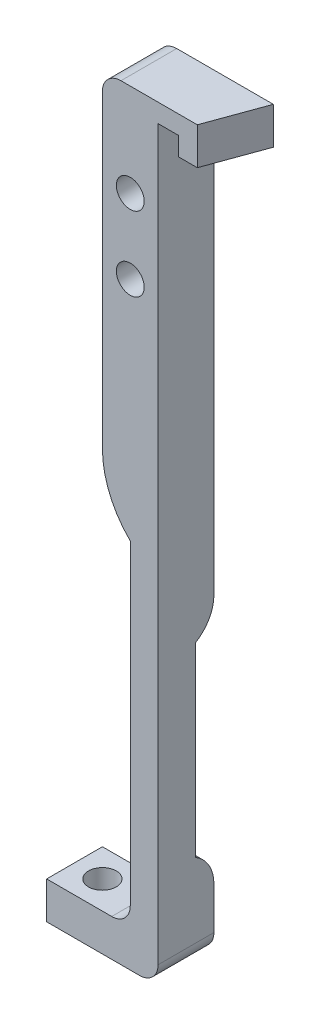
ISO-10303-21;
HEADER;
FILE_DESCRIPTION(('STEP AP214'),'2;1');
FILE_NAME('part.step','',(''),(''),'','','');
FILE_SCHEMA(('AUTOMOTIVE_DESIGN { 1 0 10303 214 1 1 1 1 }'));
ENDSEC;
DATA;
#1=APPLICATION_CONTEXT('core data for automotive mechanical design processes');
#2=APPLICATION_PROTOCOL_DEFINITION('international standard','automotive_design',2000,#1);
#3=PRODUCT_CONTEXT('',#1,'mechanical');
#4=PRODUCT('Part','Part','',(#3));
#5=PRODUCT_RELATED_PRODUCT_CATEGORY('part','',(#4));
#6=PRODUCT_DEFINITION_FORMATION('','',#4);
#7=PRODUCT_DEFINITION_CONTEXT('part definition',#1,'design');
#8=PRODUCT_DEFINITION('design','',#6,#7);
#9=PRODUCT_DEFINITION_SHAPE('','',#8);
#10=(LENGTH_UNIT() NAMED_UNIT(*) SI_UNIT(.MILLI.,.METRE.));
#11=(NAMED_UNIT(*) PLANE_ANGLE_UNIT() SI_UNIT($,.RADIAN.));
#12=(NAMED_UNIT(*) SI_UNIT($,.STERADIAN.) SOLID_ANGLE_UNIT());
#13=UNCERTAINTY_MEASURE_WITH_UNIT(LENGTH_MEASURE(1.E-05),#10,'distance_accuracy_value','');
#14=(GEOMETRIC_REPRESENTATION_CONTEXT(3) GLOBAL_UNCERTAINTY_ASSIGNED_CONTEXT((#13)) GLOBAL_UNIT_ASSIGNED_CONTEXT((#10,
#11,#12)) REPRESENTATION_CONTEXT('',''));
#15=CARTESIAN_POINT('',(0.,0.,0.));
#16=DIRECTION('',(0.,0.,1.));
#17=DIRECTION('',(1.,0.,0.));
#18=AXIS2_PLACEMENT_3D('',#15,#16,#17);
#19=CARTESIAN_POINT('',(7.62,0.,-15.24));
#20=DIRECTION('',(0.,0.,1.));
#21=DIRECTION('',(-1.,0.,0.));
#22=AXIS2_PLACEMENT_3D('',#19,#20,#21);
#23=PLANE('',#22);
#24=CARTESIAN_POINT('',(3.81,91.948,-15.24));
#25=DIRECTION('',(0.,0.,1.));
#26=DIRECTION('',(1.,0.,0.));
#27=AXIS2_PLACEMENT_3D('',#24,#25,#26);
#28=CIRCLE('',#27,1.90500000000001);
#29=CARTESIAN_POINT('',(5.71500000000001,91.948,-15.24));
#30=VERTEX_POINT('',#29);
#31=EDGE_CURVE('E193',#30,#30,#28,.T.);
#32=ORIENTED_EDGE('',*,*,#31,.T.);
#33=EDGE_LOOP('',(#32));
#34=FACE_BOUND('',#33,.T.);
#35=CARTESIAN_POINT('',(3.81,81.788,-15.24));
#36=DIRECTION('',(0.,0.,1.));
#37=DIRECTION('',(1.,0.,0.));
#38=AXIS2_PLACEMENT_3D('',#35,#36,#37);
#39=CIRCLE('',#38,1.90500000000001);
#40=CARTESIAN_POINT('',(5.71500000000001,81.788,-15.24));
#41=VERTEX_POINT('',#40);
#42=EDGE_CURVE('E189',#41,#41,#39,.T.);
#43=ORIENTED_EDGE('',*,*,#42,.T.);
#44=EDGE_LOOP('',(#43));
#45=FACE_BOUND('',#44,.T.);
#46=DIRECTION('',(0.,-1.,0.));
#47=VECTOR('',#46,1.);
#48=CARTESIAN_POINT('',(7.62,0.,-15.24));
#49=LINE('',#48,#47);
#50=CARTESIAN_POINT('',(7.62,102.108,-15.24));
#51=VERTEX_POINT('',#50);
#52=CARTESIAN_POINT('',(7.62,42.4994090512249,-15.24));
#53=VERTEX_POINT('',#52);
#54=EDGE_CURVE('E246',#51,#53,#49,.T.);
#55=ORIENTED_EDGE('',*,*,#54,.T.);
#56=DIRECTION('',(1.,0.,0.));
#57=VECTOR('',#56,1.);
#58=CARTESIAN_POINT('',(7.62,42.4994090512249,-15.24));
#59=LINE('',#58,#57);
#60=CARTESIAN_POINT('',(3.81,42.4994090512249,-15.24));
#61=VERTEX_POINT('',#60);
#62=EDGE_CURVE('E11',#53,#61,#59,.F.);
#63=ORIENTED_EDGE('',*,*,#62,.T.);
#64=DIRECTION('',(0.,1.,0.));
#65=VECTOR('',#64,1.);
#66=CARTESIAN_POINT('',(3.81,5.08,-15.24));
#67=LINE('',#66,#65);
#68=CARTESIAN_POINT('',(3.81,50.8,-15.24));
#69=VERTEX_POINT('',#68);
#70=EDGE_CURVE('E200',#61,#69,#67,.T.);
#71=ORIENTED_EDGE('',*,*,#70,.T.);
#72=CARTESIAN_POINT('',(12.7,59.8696141042494,-15.24));
#73=DIRECTION('',(0.,0.,-1.));
#74=DIRECTION('',(-1.,0.,0.));
#75=AXIS2_PLACEMENT_3D('',#72,#73,#74);
#76=CIRCLE('',#75,12.7);
#77=CARTESIAN_POINT('',(0.,59.8696141042494,-15.24));
#78=VERTEX_POINT('',#77);
#79=EDGE_CURVE('E340',#78,#69,#76,.F.);
#80=ORIENTED_EDGE('',*,*,#79,.F.);
#81=DIRECTION('',(0.,-1.,0.));
#82=VECTOR('',#81,1.);
#83=CARTESIAN_POINT('',(0.,0.,-15.24));
#84=LINE('',#83,#82);
#85=CARTESIAN_POINT('',(0.,102.108,-15.24));
#86=VERTEX_POINT('',#85);
#87=EDGE_CURVE('E263',#86,#78,#84,.T.);
#88=ORIENTED_EDGE('',*,*,#87,.F.);
#89=CARTESIAN_POINT('',(2.54,102.108,-15.24));
#90=DIRECTION('',(0.,0.,-1.));
#91=DIRECTION('',(-1.,0.,0.));
#92=AXIS2_PLACEMENT_3D('',#89,#90,#91);
#93=CIRCLE('',#92,2.54);
#94=CARTESIAN_POINT('',(2.54,104.648,-15.24));
#95=VERTEX_POINT('',#94);
#96=EDGE_CURVE('E305',#95,#86,#93,.F.);
#97=ORIENTED_EDGE('',*,*,#96,.F.);
#98=DIRECTION('',(-1.,0.,0.));
#99=VECTOR('',#98,1.);
#100=CARTESIAN_POINT('',(7.62,104.648,-15.24));
#101=LINE('',#100,#99);
#102=CARTESIAN_POINT('',(15.748,104.648,-15.24));
#103=VERTEX_POINT('',#102);
#104=EDGE_CURVE('E271',#103,#95,#101,.T.);
#105=ORIENTED_EDGE('',*,*,#104,.F.);
#106=DIRECTION('',(0.,-1.,0.));
#107=VECTOR('',#106,1.);
#108=CARTESIAN_POINT('',(15.748,104.648,-15.24));
#109=LINE('',#108,#107);
#110=CARTESIAN_POINT('',(15.748,99.568,-15.24));
#111=VERTEX_POINT('',#110);
#112=EDGE_CURVE('E234',#103,#111,#109,.T.);
#113=ORIENTED_EDGE('',*,*,#112,.T.);
#114=DIRECTION('',(-1.,0.,0.));
#115=VECTOR('',#114,1.);
#116=CARTESIAN_POINT('',(15.748,99.568,-15.24));
#117=LINE('',#116,#115);
#118=CARTESIAN_POINT('',(13.2079999999999,99.568,-15.24));
#119=VERTEX_POINT('',#118);
#120=EDGE_CURVE('E214',#111,#119,#117,.T.);
#121=ORIENTED_EDGE('',*,*,#120,.T.);
#122=DIRECTION('',(0.,1.,0.));
#123=VECTOR('',#122,1.);
#124=CARTESIAN_POINT('',(13.2079999999999,99.568,-15.24));
#125=LINE('',#124,#123);
#126=CARTESIAN_POINT('',(13.2079999999999,102.108,-15.24));
#127=VERTEX_POINT('',#126);
#128=EDGE_CURVE('E231',#119,#127,#125,.T.);
#129=ORIENTED_EDGE('',*,*,#128,.T.);
#130=DIRECTION('',(-1.,0.,0.));
#131=VECTOR('',#130,1.);
#132=CARTESIAN_POINT('',(15.748,102.108,-15.24));
#133=LINE('',#132,#131);
#134=EDGE_CURVE('E255',#127,#51,#133,.T.);
#135=ORIENTED_EDGE('',*,*,#134,.T.);
#136=EDGE_LOOP('',(#55,#63,#71,#80,#88,#97,#105,#113,#121,#129,#135));
#137=FACE_BOUND('',#136,.T.);
#138=ADVANCED_FACE('F32',(#34,#45,#137),#23,.F.);
#139=CARTESIAN_POINT('',(15.748,102.108,-15.24));
#140=DIRECTION('',(0.,1.,0.));
#141=DIRECTION('',(0.,0.,-1.));
#142=AXIS2_PLACEMENT_3D('',#139,#140,#141);
#143=PLANE('',#142);
#144=DIRECTION('',(-0.342020143325663,0.,0.93969262078591));
#145=VECTOR('',#144,1.);
#146=CARTESIAN_POINT('',(10.4345468148915,102.108,-7.62));
#147=LINE('',#146,#145);
#148=CARTESIAN_POINT('',(10.4345468148915,102.108,-7.62));
#149=VERTEX_POINT('',#148);
#150=EDGE_CURVE('E213',#127,#149,#147,.T.);
#151=ORIENTED_EDGE('',*,*,#150,.T.);
#152=DIRECTION('',(-1.,0.,0.));
#153=VECTOR('',#152,1.);
#154=CARTESIAN_POINT('',(15.748,102.108,-7.62));
#155=LINE('',#154,#153);
#156=CARTESIAN_POINT('',(7.62,102.108,-7.62));
#157=VERTEX_POINT('',#156);
#158=EDGE_CURVE('E237',#149,#157,#155,.T.);
#159=ORIENTED_EDGE('',*,*,#158,.T.);
#160=DIRECTION('',(0.,0.,1.));
#161=VECTOR('',#160,1.);
#162=CARTESIAN_POINT('',(7.62,102.108,-15.24));
#163=LINE('',#162,#161);
#164=EDGE_CURVE('E233',#51,#157,#163,.T.);
#165=ORIENTED_EDGE('',*,*,#164,.F.);
#166=ORIENTED_EDGE('',*,*,#134,.F.);
#167=EDGE_LOOP('',(#151,#159,#165,#166));
#168=FACE_BOUND('',#167,.T.);
#169=ADVANCED_FACE('F394',(#168),#143,.F.);
#170=CARTESIAN_POINT('',(7.62,0.,-15.24));
#171=DIRECTION('',(-1.,0.,0.));
#172=DIRECTION('',(0.,0.,-1.));
#173=AXIS2_PLACEMENT_3D('',#170,#171,#172);
#174=PLANE('',#173);
#175=CARTESIAN_POINT('',(7.62,8.30059094877505,-15.24));
#176=VERTEX_POINT('',#175);
#177=CARTESIAN_POINT('',(7.62,2.54,-15.24));
#178=VERTEX_POINT('',#177);
#179=EDGE_CURVE('E262',#176,#178,#49,.T.);
#180=ORIENTED_EDGE('',*,*,#179,.F.);
#181=CARTESIAN_POINT('',(7.62,8.30059094877505,-10.16));
#182=DIRECTION('',(-1.,0.,0.));
#183=DIRECTION('',(0.,0.,1.));
#184=AXIS2_PLACEMENT_3D('',#181,#182,#183);
#185=CIRCLE('',#184,5.08);
#186=CARTESIAN_POINT('',(7.62,12.7,-12.7));
#187=VERTEX_POINT('',#186);
#188=EDGE_CURVE('E40',#176,#187,#185,.F.);
#189=ORIENTED_EDGE('',*,*,#188,.T.);
#190=DIRECTION('',(0.,1.,0.));
#191=VECTOR('',#190,1.);
#192=CARTESIAN_POINT('',(7.62,0.,-12.7));
#193=LINE('',#192,#191);
#194=CARTESIAN_POINT('',(7.62,38.1,-12.7));
#195=VERTEX_POINT('',#194);
#196=EDGE_CURVE('E180',#187,#195,#193,.T.);
#197=ORIENTED_EDGE('',*,*,#196,.T.);
#198=CARTESIAN_POINT('',(7.62,42.4994090512249,-10.16));
#199=DIRECTION('',(-1.,0.,0.));
#200=DIRECTION('',(0.,0.,1.));
#201=AXIS2_PLACEMENT_3D('',#198,#199,#200);
#202=CIRCLE('',#201,5.08);
#203=EDGE_CURVE('E47',#195,#53,#202,.F.);
#204=ORIENTED_EDGE('',*,*,#203,.T.);
#205=ORIENTED_EDGE('',*,*,#54,.F.);
#206=ORIENTED_EDGE('',*,*,#164,.T.);
#207=DIRECTION('',(0.,1.,0.));
#208=VECTOR('',#207,1.);
#209=CARTESIAN_POINT('',(7.62,0.,-7.62));
#210=LINE('',#209,#208);
#211=CARTESIAN_POINT('',(7.62,2.54,-7.62));
#212=VERTEX_POINT('',#211);
#213=EDGE_CURVE('E275',#212,#157,#210,.T.);
#214=ORIENTED_EDGE('',*,*,#213,.F.);
#215=DIRECTION('',(0.,0.,1.));
#216=VECTOR('',#215,1.);
#217=CARTESIAN_POINT('',(7.62,2.54,-15.24));
#218=LINE('',#217,#216);
#219=EDGE_CURVE('E341',#178,#212,#218,.T.);
#220=ORIENTED_EDGE('',*,*,#219,.F.);
#221=EDGE_LOOP('',(#180,#189,#197,#204,#205,#206,#214,#220));
#222=FACE_BOUND('',#221,.T.);
#223=ADVANCED_FACE('F386',(#222),#174,.F.);
#224=CARTESIAN_POINT('',(3.81,7.62,-15.24));
#225=VERTEX_POINT('',#224);
#226=CARTESIAN_POINT('',(3.81,8.30059094877505,-15.24));
#227=VERTEX_POINT('',#226);
#228=EDGE_CURVE('E201',#225,#227,#67,.T.);
#229=ORIENTED_EDGE('',*,*,#228,.T.);
#230=DIRECTION('',(-1.,0.,0.));
#231=VECTOR('',#230,1.);
#232=CARTESIAN_POINT('',(7.62,8.30059094877505,-15.24));
#233=LINE('',#232,#231);
#234=EDGE_CURVE('E55',#227,#176,#233,.F.);
#235=ORIENTED_EDGE('',*,*,#234,.T.);
#236=ORIENTED_EDGE('',*,*,#179,.T.);
#237=CARTESIAN_POINT('',(5.08,2.54,-15.24));
#238=DIRECTION('',(0.,0.,-1.));
#239=DIRECTION('',(-1.,0.,0.));
#240=AXIS2_PLACEMENT_3D('',#237,#238,#239);
#241=CIRCLE('',#240,2.54);
#242=CARTESIAN_POINT('',(5.08,0.,-15.24));
#243=VERTEX_POINT('',#242);
#244=EDGE_CURVE('E308',#243,#178,#241,.F.);
#245=ORIENTED_EDGE('',*,*,#244,.F.);
#246=DIRECTION('',(-1.,0.,0.));
#247=VECTOR('',#246,1.);
#248=CARTESIAN_POINT('',(7.62,0.,-15.24));
#249=LINE('',#248,#247);
#250=CARTESIAN_POINT('',(-7.62,0.,-15.24));
#251=VERTEX_POINT('',#250);
#252=EDGE_CURVE('E281',#243,#251,#249,.T.);
#253=ORIENTED_EDGE('',*,*,#252,.T.);
#254=DIRECTION('',(0.,1.,0.));
#255=VECTOR('',#254,1.);
#256=CARTESIAN_POINT('',(-7.62,0.,-15.24));
#257=LINE('',#256,#255);
#258=CARTESIAN_POINT('',(-7.62,5.08,-15.24));
#259=VERTEX_POINT('',#258);
#260=EDGE_CURVE('E240',#251,#259,#257,.T.);
#261=ORIENTED_EDGE('',*,*,#260,.T.);
#262=DIRECTION('',(1.,0.,0.));
#263=VECTOR('',#262,1.);
#264=CARTESIAN_POINT('',(-7.62,5.08,-15.24));
#265=LINE('',#264,#263);
#266=CARTESIAN_POINT('',(1.27,5.08,-15.24));
#267=VERTEX_POINT('',#266);
#268=EDGE_CURVE('E287',#259,#267,#265,.T.);
#269=ORIENTED_EDGE('',*,*,#268,.T.);
#270=CARTESIAN_POINT('',(1.27,7.62,-15.24));
#271=DIRECTION('',(0.,0.,-1.));
#272=DIRECTION('',(-1.,0.,0.));
#273=AXIS2_PLACEMENT_3D('',#270,#271,#272);
#274=CIRCLE('',#273,2.54);
#275=EDGE_CURVE('E319',#225,#267,#274,.T.);
#276=ORIENTED_EDGE('',*,*,#275,.F.);
#277=EDGE_LOOP('',(#229,#235,#236,#245,#253,#261,#269,#276));
#278=FACE_BOUND('',#277,.T.);
#279=ADVANCED_FACE('F355',(#278),#23,.F.);
#280=CARTESIAN_POINT('',(7.62,0.,-15.24));
#281=DIRECTION('',(0.,1.,0.));
#282=DIRECTION('',(0.,0.,-1.));
#283=AXIS2_PLACEMENT_3D('',#280,#281,#282);
#284=PLANE('',#283);
#285=CARTESIAN_POINT('',(-3.81,0.,-11.43));
#286=DIRECTION('',(0.,-1.,0.));
#287=DIRECTION('',(0.,0.,-1.));
#288=AXIS2_PLACEMENT_3D('',#285,#286,#287);
#289=CIRCLE('',#288,1.89865);
#290=CARTESIAN_POINT('',(-3.81,0.,-13.32865));
#291=VERTEX_POINT('',#290);
#292=EDGE_CURVE('E210',#291,#291,#289,.T.);
#293=ORIENTED_EDGE('',*,*,#292,.F.);
#294=EDGE_LOOP('',(#293));
#295=FACE_BOUND('',#294,.T.);
#296=DIRECTION('',(-1.,0.,0.));
#297=VECTOR('',#296,1.);
#298=CARTESIAN_POINT('',(7.62,0.,-7.62));
#299=LINE('',#298,#297);
#300=CARTESIAN_POINT('',(5.08,0.,-7.62));
#301=VERTEX_POINT('',#300);
#302=CARTESIAN_POINT('',(-7.62,0.,-7.62));
#303=VERTEX_POINT('',#302);
#304=EDGE_CURVE('E278',#301,#303,#299,.T.);
#305=ORIENTED_EDGE('',*,*,#304,.T.);
#306=DIRECTION('',(0.,0.,-1.));
#307=VECTOR('',#306,1.);
#308=CARTESIAN_POINT('',(-7.62,0.,-15.24));
#309=LINE('',#308,#307);
#310=EDGE_CURVE('E288',#303,#251,#309,.T.);
#311=ORIENTED_EDGE('',*,*,#310,.T.);
#312=ORIENTED_EDGE('',*,*,#252,.F.);
#313=DIRECTION('',(0.,0.,1.));
#314=VECTOR('',#313,1.);
#315=CARTESIAN_POINT('',(5.08,0.,-15.24));
#316=LINE('',#315,#314);
#317=EDGE_CURVE('E303',#301,#243,#316,.F.);
#318=ORIENTED_EDGE('',*,*,#317,.F.);
#319=EDGE_LOOP('',(#305,#311,#312,#318));
#320=FACE_BOUND('',#319,.T.);
#321=ADVANCED_FACE('F356',(#295,#320),#284,.F.);
#322=CARTESIAN_POINT('',(7.62,0.,-7.62));
#323=DIRECTION('',(0.,0.,-1.));
#324=DIRECTION('',(1.,0.,0.));
#325=AXIS2_PLACEMENT_3D('',#322,#323,#324);
#326=PLANE('',#325);
#327=CARTESIAN_POINT('',(3.81,81.788,-7.62));
#328=DIRECTION('',(0.,0.,1.));
#329=DIRECTION('',(1.,0.,0.));
#330=AXIS2_PLACEMENT_3D('',#327,#328,#329);
#331=CIRCLE('',#330,1.90500000000001);
#332=CARTESIAN_POINT('',(5.71500000000001,81.788,-7.62));
#333=VERTEX_POINT('',#332);
#334=EDGE_CURVE('E192',#333,#333,#331,.T.);
#335=ORIENTED_EDGE('',*,*,#334,.F.);
#336=EDGE_LOOP('',(#335));
#337=FACE_BOUND('',#336,.T.);
#338=CARTESIAN_POINT('',(3.81,91.948,-7.62));
#339=DIRECTION('',(0.,0.,1.));
#340=DIRECTION('',(1.,0.,0.));
#341=AXIS2_PLACEMENT_3D('',#338,#339,#340);
#342=CIRCLE('',#341,1.90500000000001);
#343=CARTESIAN_POINT('',(5.71500000000001,91.948,-7.62));
#344=VERTEX_POINT('',#343);
#345=EDGE_CURVE('E196',#344,#344,#342,.T.);
#346=ORIENTED_EDGE('',*,*,#345,.F.);
#347=EDGE_LOOP('',(#346));
#348=FACE_BOUND('',#347,.T.);
#349=ORIENTED_EDGE('',*,*,#213,.T.);
#350=ORIENTED_EDGE('',*,*,#158,.F.);
#351=DIRECTION('',(0.,1.,0.));
#352=VECTOR('',#351,1.);
#353=CARTESIAN_POINT('',(10.4345468148915,99.568,-7.62));
#354=LINE('',#353,#352);
#355=CARTESIAN_POINT('',(10.4345468148915,99.568,-7.62));
#356=VERTEX_POINT('',#355);
#357=EDGE_CURVE('E229',#356,#149,#354,.T.);
#358=ORIENTED_EDGE('',*,*,#357,.F.);
#359=DIRECTION('',(1.,0.,0.));
#360=VECTOR('',#359,1.);
#361=CARTESIAN_POINT('',(10.4345468148915,99.568,-7.62));
#362=LINE('',#361,#360);
#363=CARTESIAN_POINT('',(12.9745468148915,99.568,-7.62));
#364=VERTEX_POINT('',#363);
#365=EDGE_CURVE('E219',#356,#364,#362,.T.);
#366=ORIENTED_EDGE('',*,*,#365,.T.);
#367=DIRECTION('',(0.,1.,0.));
#368=VECTOR('',#367,1.);
#369=CARTESIAN_POINT('',(12.9745468148915,99.568,-7.62));
#370=LINE('',#369,#368);
#371=CARTESIAN_POINT('',(12.9745468148915,104.648,-7.62));
#372=VERTEX_POINT('',#371);
#373=EDGE_CURVE('E224',#364,#372,#370,.T.);
#374=ORIENTED_EDGE('',*,*,#373,.T.);
#375=DIRECTION('',(-1.,0.,0.));
#376=VECTOR('',#375,1.);
#377=CARTESIAN_POINT('',(7.62,104.648,-7.62));
#378=LINE('',#377,#376);
#379=CARTESIAN_POINT('',(2.54,104.648,-7.62));
#380=VERTEX_POINT('',#379);
#381=EDGE_CURVE('E274',#372,#380,#378,.T.);
#382=ORIENTED_EDGE('',*,*,#381,.T.);
#383=CARTESIAN_POINT('',(2.54,102.108,-7.62));
#384=DIRECTION('',(0.,0.,1.));
#385=DIRECTION('',(1.,0.,0.));
#386=AXIS2_PLACEMENT_3D('',#383,#384,#385);
#387=CIRCLE('',#386,2.54);
#388=CARTESIAN_POINT('',(0.,102.108,-7.62));
#389=VERTEX_POINT('',#388);
#390=EDGE_CURVE('E344',#389,#380,#387,.F.);
#391=ORIENTED_EDGE('',*,*,#390,.F.);
#392=DIRECTION('',(0.,1.,0.));
#393=VECTOR('',#392,1.);
#394=CARTESIAN_POINT('',(0.,0.,-7.62));
#395=LINE('',#394,#393);
#396=CARTESIAN_POINT('',(0.,59.8696141042494,-7.62));
#397=VERTEX_POINT('',#396);
#398=EDGE_CURVE('E258',#397,#389,#395,.T.);
#399=ORIENTED_EDGE('',*,*,#398,.F.);
#400=CARTESIAN_POINT('',(12.7,59.8696141042494,-7.62));
#401=DIRECTION('',(0.,0.,1.));
#402=DIRECTION('',(1.,0.,0.));
#403=AXIS2_PLACEMENT_3D('',#400,#401,#402);
#404=CIRCLE('',#403,12.7);
#405=CARTESIAN_POINT('',(3.81,50.8,-7.62));
#406=VERTEX_POINT('',#405);
#407=EDGE_CURVE('E264',#406,#397,#404,.F.);
#408=ORIENTED_EDGE('',*,*,#407,.F.);
#409=DIRECTION('',(0.,-1.,0.));
#410=VECTOR('',#409,1.);
#411=CARTESIAN_POINT('',(3.81,5.08,-7.62));
#412=LINE('',#411,#410);
#413=CARTESIAN_POINT('',(3.81,7.62,-7.62));
#414=VERTEX_POINT('',#413);
#415=EDGE_CURVE('E197',#406,#414,#412,.T.);
#416=ORIENTED_EDGE('',*,*,#415,.T.);
#417=CARTESIAN_POINT('',(1.27,7.62,-7.62));
#418=DIRECTION('',(0.,0.,1.));
#419=DIRECTION('',(1.,0.,0.));
#420=AXIS2_PLACEMENT_3D('',#417,#418,#419);
#421=CIRCLE('',#420,2.54);
#422=CARTESIAN_POINT('',(1.27,5.08,-7.62));
#423=VERTEX_POINT('',#422);
#424=EDGE_CURVE('E322',#423,#414,#421,.T.);
#425=ORIENTED_EDGE('',*,*,#424,.F.);
#426=DIRECTION('',(1.,0.,0.));
#427=VECTOR('',#426,1.);
#428=CARTESIAN_POINT('',(-7.62,5.08,-7.62));
#429=LINE('',#428,#427);
#430=CARTESIAN_POINT('',(-7.62,5.08,-7.62));
#431=VERTEX_POINT('',#430);
#432=EDGE_CURVE('E284',#431,#423,#429,.T.);
#433=ORIENTED_EDGE('',*,*,#432,.F.);
#434=DIRECTION('',(0.,-1.,0.));
#435=VECTOR('',#434,1.);
#436=CARTESIAN_POINT('',(-7.62,0.,-7.62));
#437=LINE('',#436,#435);
#438=EDGE_CURVE('E361',#431,#303,#437,.T.);
#439=ORIENTED_EDGE('',*,*,#438,.T.);
#440=ORIENTED_EDGE('',*,*,#304,.F.);
#441=CARTESIAN_POINT('',(5.08,2.54,-7.62));
#442=DIRECTION('',(0.,0.,1.));
#443=DIRECTION('',(1.,0.,0.));
#444=AXIS2_PLACEMENT_3D('',#441,#442,#443);
#445=CIRCLE('',#444,2.54);
#446=EDGE_CURVE('E346',#212,#301,#445,.F.);
#447=ORIENTED_EDGE('',*,*,#446,.F.);
#448=EDGE_LOOP('',(#349,#350,#358,#366,#374,#382,#391,#399,#408,#416,#425,#433,#439,#440,#447));
#449=FACE_BOUND('',#448,.T.);
#450=ADVANCED_FACE('F367',(#337,#348,#449),#326,.F.);
#451=CARTESIAN_POINT('',(7.62,104.648,-15.24));
#452=DIRECTION('',(0.,-1.,0.));
#453=DIRECTION('',(0.,0.,1.));
#454=AXIS2_PLACEMENT_3D('',#451,#452,#453);
#455=PLANE('',#454);
#456=ORIENTED_EDGE('',*,*,#381,.F.);
#457=DIRECTION('',(-0.342020143325669,0.,0.939692620785908));
#458=VECTOR('',#457,1.);
#459=CARTESIAN_POINT('',(12.9745468148915,104.648,-7.62));
#460=LINE('',#459,#458);
#461=EDGE_CURVE('E205',#103,#372,#460,.T.);
#462=ORIENTED_EDGE('',*,*,#461,.F.);
#463=ORIENTED_EDGE('',*,*,#104,.T.);
#464=DIRECTION('',(0.,0.,-1.));
#465=VECTOR('',#464,1.);
#466=CARTESIAN_POINT('',(2.54,104.648,-15.24));
#467=LINE('',#466,#465);
#468=EDGE_CURVE('E311',#380,#95,#467,.T.);
#469=ORIENTED_EDGE('',*,*,#468,.F.);
#470=EDGE_LOOP('',(#456,#462,#463,#469));
#471=FACE_BOUND('',#470,.T.);
#472=ADVANCED_FACE('F409',(#471),#455,.F.);
#473=CARTESIAN_POINT('',(0.,0.,-15.24));
#474=DIRECTION('',(-1.,0.,0.));
#475=DIRECTION('',(0.,0.,-1.));
#476=AXIS2_PLACEMENT_3D('',#473,#474,#475);
#477=PLANE('',#476);
#478=ORIENTED_EDGE('',*,*,#87,.T.);
#479=DIRECTION('',(0.,0.,-1.));
#480=VECTOR('',#479,1.);
#481=CARTESIAN_POINT('',(0.,59.8696141042494,-15.24));
#482=LINE('',#481,#480);
#483=EDGE_CURVE('E379',#397,#78,#482,.T.);
#484=ORIENTED_EDGE('',*,*,#483,.F.);
#485=ORIENTED_EDGE('',*,*,#398,.T.);
#486=DIRECTION('',(0.,0.,-1.));
#487=VECTOR('',#486,1.);
#488=CARTESIAN_POINT('',(0.,102.108,-7.62));
#489=LINE('',#488,#487);
#490=EDGE_CURVE('E313',#86,#389,#489,.F.);
#491=ORIENTED_EDGE('',*,*,#490,.F.);
#492=EDGE_LOOP('',(#478,#484,#485,#491));
#493=FACE_BOUND('',#492,.T.);
#494=ADVANCED_FACE('F412',(#493),#477,.T.);
#495=CARTESIAN_POINT('',(-7.62,5.08,-15.24));
#496=DIRECTION('',(0.,-1.,0.));
#497=DIRECTION('',(0.,0.,1.));
#498=AXIS2_PLACEMENT_3D('',#495,#496,#497);
#499=PLANE('',#498);
#500=CARTESIAN_POINT('',(-3.81,5.08,-11.43));
#501=DIRECTION('',(0.,-1.,0.));
#502=DIRECTION('',(0.,0.,-1.));
#503=AXIS2_PLACEMENT_3D('',#500,#501,#502);
#504=CIRCLE('',#503,1.89865);
#505=CARTESIAN_POINT('',(-3.81,5.08,-13.32865));
#506=VERTEX_POINT('',#505);
#507=EDGE_CURVE('E207',#506,#506,#504,.T.);
#508=ORIENTED_EDGE('',*,*,#507,.T.);
#509=EDGE_LOOP('',(#508));
#510=FACE_BOUND('',#509,.T.);
#511=ORIENTED_EDGE('',*,*,#268,.F.);
#512=DIRECTION('',(0.,0.,1.));
#513=VECTOR('',#512,1.);
#514=CARTESIAN_POINT('',(-7.62,5.08,-15.24));
#515=LINE('',#514,#513);
#516=EDGE_CURVE('E363',#259,#431,#515,.T.);
#517=ORIENTED_EDGE('',*,*,#516,.T.);
#518=ORIENTED_EDGE('',*,*,#432,.T.);
#519=DIRECTION('',(0.,0.,-1.));
#520=VECTOR('',#519,1.);
#521=CARTESIAN_POINT('',(1.27,5.08,-7.62));
#522=LINE('',#521,#520);
#523=EDGE_CURVE('E317',#267,#423,#522,.F.);
#524=ORIENTED_EDGE('',*,*,#523,.F.);
#525=EDGE_LOOP('',(#511,#517,#518,#524));
#526=FACE_BOUND('',#525,.T.);
#527=ADVANCED_FACE('F369',(#510,#526),#499,.F.);
#528=CARTESIAN_POINT('',(-7.62,0.,-15.24));
#529=DIRECTION('',(-1.,0.,0.));
#530=DIRECTION('',(0.,0.,-1.));
#531=AXIS2_PLACEMENT_3D('',#528,#529,#530);
#532=PLANE('',#531);
#533=ORIENTED_EDGE('',*,*,#260,.F.);
#534=ORIENTED_EDGE('',*,*,#310,.F.);
#535=ORIENTED_EDGE('',*,*,#438,.F.);
#536=ORIENTED_EDGE('',*,*,#516,.F.);
#537=EDGE_LOOP('',(#533,#534,#535,#536));
#538=FACE_BOUND('',#537,.T.);
#539=ADVANCED_FACE('F362',(#538),#532,.T.);
#540=CARTESIAN_POINT('',(10.4345468148915,99.568,-7.62));
#541=DIRECTION('',(0.939692620785911,0.,0.342020143325663));
#542=DIRECTION('',(-0.342020143325663,0.,0.939692620785911));
#543=AXIS2_PLACEMENT_3D('',#540,#541,#542);
#544=PLANE('',#543);
#545=ORIENTED_EDGE('',*,*,#150,.F.);
#546=ORIENTED_EDGE('',*,*,#128,.F.);
#547=DIRECTION('',(-0.342020143325663,0.,0.93969262078591));
#548=VECTOR('',#547,1.);
#549=CARTESIAN_POINT('',(10.4345468148915,99.568,-7.62));
#550=LINE('',#549,#548);
#551=EDGE_CURVE('E217',#119,#356,#550,.T.);
#552=ORIENTED_EDGE('',*,*,#551,.T.);
#553=ORIENTED_EDGE('',*,*,#357,.T.);
#554=EDGE_LOOP('',(#545,#546,#552,#553));
#555=FACE_BOUND('',#554,.T.);
#556=ADVANCED_FACE('F397',(#555),#544,.F.);
#557=CARTESIAN_POINT('',(15.748,99.568,-15.24));
#558=DIRECTION('',(-0.939692620785908,0.,-0.342020143325669));
#559=DIRECTION('',(0.342020143325669,0.,-0.939692620785908));
#560=AXIS2_PLACEMENT_3D('',#557,#558,#559);
#561=PLANE('',#560);
#562=ORIENTED_EDGE('',*,*,#373,.F.);
#563=DIRECTION('',(0.342020143325669,0.,-0.939692620785908));
#564=VECTOR('',#563,1.);
#565=CARTESIAN_POINT('',(15.748,99.568,-15.24));
#566=LINE('',#565,#564);
#567=EDGE_CURVE('E222',#364,#111,#566,.T.);
#568=ORIENTED_EDGE('',*,*,#567,.T.);
#569=ORIENTED_EDGE('',*,*,#112,.F.);
#570=ORIENTED_EDGE('',*,*,#461,.T.);
#571=EDGE_LOOP('',(#562,#568,#569,#570));
#572=FACE_BOUND('',#571,.T.);
#573=ADVANCED_FACE('F405',(#572),#561,.F.);
#574=CARTESIAN_POINT('',(0.,99.568,-15.24));
#575=DIRECTION('',(0.,1.,0.));
#576=DIRECTION('',(0.,0.,-1.));
#577=AXIS2_PLACEMENT_3D('',#574,#575,#576);
#578=PLANE('',#577);
#579=ORIENTED_EDGE('',*,*,#120,.F.);
#580=ORIENTED_EDGE('',*,*,#567,.F.);
#581=ORIENTED_EDGE('',*,*,#365,.F.);
#582=ORIENTED_EDGE('',*,*,#551,.F.);
#583=EDGE_LOOP('',(#579,#580,#581,#582));
#584=FACE_BOUND('',#583,.T.);
#585=ADVANCED_FACE('F401',(#584),#578,.F.);
#586=CARTESIAN_POINT('',(-3.81,5.08,-11.43));
#587=DIRECTION('',(0.,1.,0.));
#588=DIRECTION('',(0.,0.,-1.));
#589=AXIS2_PLACEMENT_3D('',#586,#587,#588);
#590=CYLINDRICAL_SURFACE('',#589,1.89865);
#591=ORIENTED_EDGE('',*,*,#292,.T.);
#592=EDGE_LOOP('',(#591));
#593=FACE_BOUND('',#592,.T.);
#594=ORIENTED_EDGE('',*,*,#507,.F.);
#595=EDGE_LOOP('',(#594));
#596=FACE_BOUND('',#595,.T.);
#597=ADVANCED_FACE('F450',(#593,#596),#590,.F.);
#598=CARTESIAN_POINT('',(3.81,0.,-15.24));
#599=DIRECTION('',(1.,0.,0.));
#600=DIRECTION('',(0.,0.,1.));
#601=AXIS2_PLACEMENT_3D('',#598,#599,#600);
#602=PLANE('',#601);
#603=DIRECTION('',(0.,1.,0.));
#604=VECTOR('',#603,1.);
#605=CARTESIAN_POINT('',(3.81,38.1,-12.7));
#606=LINE('',#605,#604);
#607=CARTESIAN_POINT('',(3.81,12.7,-12.7));
#608=VERTEX_POINT('',#607);
#609=CARTESIAN_POINT('',(3.81,38.1,-12.7));
#610=VERTEX_POINT('',#609);
#611=EDGE_CURVE('E178',#608,#610,#606,.T.);
#612=ORIENTED_EDGE('',*,*,#611,.F.);
#613=CARTESIAN_POINT('',(3.81,8.30059094877505,-10.16));
#614=DIRECTION('',(1.,0.,0.));
#615=DIRECTION('',(0.,0.,-1.));
#616=AXIS2_PLACEMENT_3D('',#613,#614,#615);
#617=CIRCLE('',#616,5.08);
#618=EDGE_CURVE('E164',#608,#227,#617,.F.);
#619=ORIENTED_EDGE('',*,*,#618,.T.);
#620=ORIENTED_EDGE('',*,*,#228,.F.);
#621=DIRECTION('',(0.,0.,-1.));
#622=VECTOR('',#621,1.);
#623=CARTESIAN_POINT('',(3.81,7.62,-15.24));
#624=LINE('',#623,#622);
#625=EDGE_CURVE('E315',#414,#225,#624,.T.);
#626=ORIENTED_EDGE('',*,*,#625,.F.);
#627=ORIENTED_EDGE('',*,*,#415,.F.);
#628=DIRECTION('',(0.,0.,1.));
#629=VECTOR('',#628,1.);
#630=CARTESIAN_POINT('',(3.81,50.8,-7.62));
#631=LINE('',#630,#629);
#632=EDGE_CURVE('E203',#69,#406,#631,.T.);
#633=ORIENTED_EDGE('',*,*,#632,.F.);
#634=ORIENTED_EDGE('',*,*,#70,.F.);
#635=CARTESIAN_POINT('',(3.81,42.4994090512249,-10.16));
#636=DIRECTION('',(1.,0.,0.));
#637=DIRECTION('',(0.,0.,-1.));
#638=AXIS2_PLACEMENT_3D('',#635,#636,#637);
#639=CIRCLE('',#638,5.08);
#640=EDGE_CURVE('E172',#61,#610,#639,.F.);
#641=ORIENTED_EDGE('',*,*,#640,.T.);
#642=EDGE_LOOP('',(#612,#619,#620,#626,#627,#633,#634,#641));
#643=FACE_BOUND('',#642,.T.);
#644=ADVANCED_FACE('F183',(#643),#602,.F.);
#645=CARTESIAN_POINT('',(12.7,59.8696141042494,-7.62));
#646=DIRECTION('',(0.,0.,1.));
#647=DIRECTION('',(-1.,0.,0.));
#648=AXIS2_PLACEMENT_3D('',#645,#646,#647);
#649=CYLINDRICAL_SURFACE('',#648,12.7);
#650=ORIENTED_EDGE('',*,*,#79,.T.);
#651=ORIENTED_EDGE('',*,*,#632,.T.);
#652=ORIENTED_EDGE('',*,*,#407,.T.);
#653=ORIENTED_EDGE('',*,*,#483,.T.);
#654=EDGE_LOOP('',(#650,#651,#652,#653));
#655=FACE_BOUND('',#654,.T.);
#656=ADVANCED_FACE('F381',(#655),#649,.T.);
#657=CARTESIAN_POINT('',(5.08,2.54,-15.24));
#658=DIRECTION('',(0.,0.,1.));
#659=DIRECTION('',(-1.,0.,0.));
#660=AXIS2_PLACEMENT_3D('',#657,#658,#659);
#661=CYLINDRICAL_SURFACE('',#660,2.54);
#662=ORIENTED_EDGE('',*,*,#244,.T.);
#663=ORIENTED_EDGE('',*,*,#219,.T.);
#664=ORIENTED_EDGE('',*,*,#446,.T.);
#665=ORIENTED_EDGE('',*,*,#317,.T.);
#666=EDGE_LOOP('',(#662,#663,#664,#665));
#667=FACE_BOUND('',#666,.T.);
#668=ADVANCED_FACE('F350',(#667),#661,.T.);
#669=CARTESIAN_POINT('',(2.54,102.108,-15.24));
#670=DIRECTION('',(0.,0.,1.));
#671=DIRECTION('',(-1.,0.,0.));
#672=AXIS2_PLACEMENT_3D('',#669,#670,#671);
#673=CYLINDRICAL_SURFACE('',#672,2.54);
#674=ORIENTED_EDGE('',*,*,#390,.T.);
#675=ORIENTED_EDGE('',*,*,#468,.T.);
#676=ORIENTED_EDGE('',*,*,#96,.T.);
#677=ORIENTED_EDGE('',*,*,#490,.T.);
#678=EDGE_LOOP('',(#674,#675,#676,#677));
#679=FACE_BOUND('',#678,.T.);
#680=ADVANCED_FACE('F411',(#679),#673,.T.);
#681=CARTESIAN_POINT('',(1.27,7.62,-15.24));
#682=DIRECTION('',(0.,0.,1.));
#683=DIRECTION('',(0.,1.,0.));
#684=AXIS2_PLACEMENT_3D('',#681,#682,#683);
#685=CYLINDRICAL_SURFACE('',#684,2.54);
#686=ORIENTED_EDGE('',*,*,#424,.T.);
#687=ORIENTED_EDGE('',*,*,#625,.T.);
#688=ORIENTED_EDGE('',*,*,#275,.T.);
#689=ORIENTED_EDGE('',*,*,#523,.T.);
#690=EDGE_LOOP('',(#686,#687,#688,#689));
#691=FACE_BOUND('',#690,.T.);
#692=ADVANCED_FACE('F371',(#691),#685,.F.);
#693=CARTESIAN_POINT('',(3.81,91.948,-7.61995));
#694=DIRECTION('',(0.,0.,-1.));
#695=DIRECTION('',(1.,0.,0.));
#696=AXIS2_PLACEMENT_3D('',#693,#694,#695);
#697=CYLINDRICAL_SURFACE('',#696,1.90500000000001);
#698=ORIENTED_EDGE('',*,*,#31,.F.);
#699=EDGE_LOOP('',(#698));
#700=FACE_BOUND('',#699,.T.);
#701=ORIENTED_EDGE('',*,*,#345,.T.);
#702=EDGE_LOOP('',(#701));
#703=FACE_BOUND('',#702,.T.);
#704=ADVANCED_FACE('F456',(#700,#703),#697,.F.);
#705=CARTESIAN_POINT('',(3.81,81.788,-7.61995));
#706=DIRECTION('',(0.,0.,-1.));
#707=DIRECTION('',(1.,0.,0.));
#708=AXIS2_PLACEMENT_3D('',#705,#706,#707);
#709=CYLINDRICAL_SURFACE('',#708,1.90500000000001);
#710=ORIENTED_EDGE('',*,*,#42,.F.);
#711=EDGE_LOOP('',(#710));
#712=FACE_BOUND('',#711,.T.);
#713=ORIENTED_EDGE('',*,*,#334,.T.);
#714=EDGE_LOOP('',(#713));
#715=FACE_BOUND('',#714,.T.);
#716=ADVANCED_FACE('F459',(#712,#715),#709,.F.);
#717=CARTESIAN_POINT('',(15.748,38.1,-12.7));
#718=DIRECTION('',(0.,0.,1.));
#719=DIRECTION('',(0.,-1.,0.));
#720=AXIS2_PLACEMENT_3D('',#717,#718,#719);
#721=PLANE('',#720);
#722=DIRECTION('',(-1.,0.,0.));
#723=VECTOR('',#722,1.);
#724=CARTESIAN_POINT('',(15.748,12.7,-12.7));
#725=LINE('',#724,#723);
#726=EDGE_CURVE('E168',#187,#608,#725,.T.);
#727=ORIENTED_EDGE('',*,*,#726,.T.);
#728=ORIENTED_EDGE('',*,*,#611,.T.);
#729=DIRECTION('',(-1.,0.,0.));
#730=VECTOR('',#729,1.);
#731=CARTESIAN_POINT('',(15.748,38.1,-12.7));
#732=LINE('',#731,#730);
#733=EDGE_CURVE('E181',#195,#610,#732,.T.);
#734=ORIENTED_EDGE('',*,*,#733,.F.);
#735=ORIENTED_EDGE('',*,*,#196,.F.);
#736=EDGE_LOOP('',(#727,#728,#734,#735));
#737=FACE_BOUND('',#736,.T.);
#738=ADVANCED_FACE('F177',(#737),#721,.F.);
#739=CARTESIAN_POINT('',(15.748,8.30059094877505,-10.16));
#740=DIRECTION('',(-1.,0.,0.));
#741=DIRECTION('',(0.,0.,1.));
#742=AXIS2_PLACEMENT_3D('',#739,#740,#741);
#743=CYLINDRICAL_SURFACE('',#742,5.08);
#744=ORIENTED_EDGE('',*,*,#188,.F.);
#745=ORIENTED_EDGE('',*,*,#234,.F.);
#746=ORIENTED_EDGE('',*,*,#618,.F.);
#747=ORIENTED_EDGE('',*,*,#726,.F.);
#748=EDGE_LOOP('',(#744,#745,#746,#747));
#749=FACE_BOUND('',#748,.T.);
#750=ADVANCED_FACE('F167',(#749),#743,.T.);
#751=CARTESIAN_POINT('',(15.748,42.4994090512249,-10.16));
#752=DIRECTION('',(1.,0.,0.));
#753=DIRECTION('',(0.,0.,-1.));
#754=AXIS2_PLACEMENT_3D('',#751,#752,#753);
#755=CYLINDRICAL_SURFACE('',#754,5.08);
#756=ORIENTED_EDGE('',*,*,#203,.F.);
#757=ORIENTED_EDGE('',*,*,#733,.T.);
#758=ORIENTED_EDGE('',*,*,#640,.F.);
#759=ORIENTED_EDGE('',*,*,#62,.F.);
#760=EDGE_LOOP('',(#756,#757,#758,#759));
#761=FACE_BOUND('',#760,.T.);
#762=ADVANCED_FACE('F34',(#761),#755,.T.);
#763=CLOSED_SHELL('',(#138,#169,#223,#279,#321,#450,#472,#494,#527,#539,#556,#573,#585,#597,
#644,#656,#668,#680,#692,#704,#716,#738,#750,#762));
#764=MANIFOLD_SOLID_BREP('B2',#763);
#765=ADVANCED_BREP_SHAPE_REPRESENTATION('',(#18,#764),#14);
#766=SHAPE_DEFINITION_REPRESENTATION(#9,#765);
ENDSEC;
END-ISO-10303-21;
